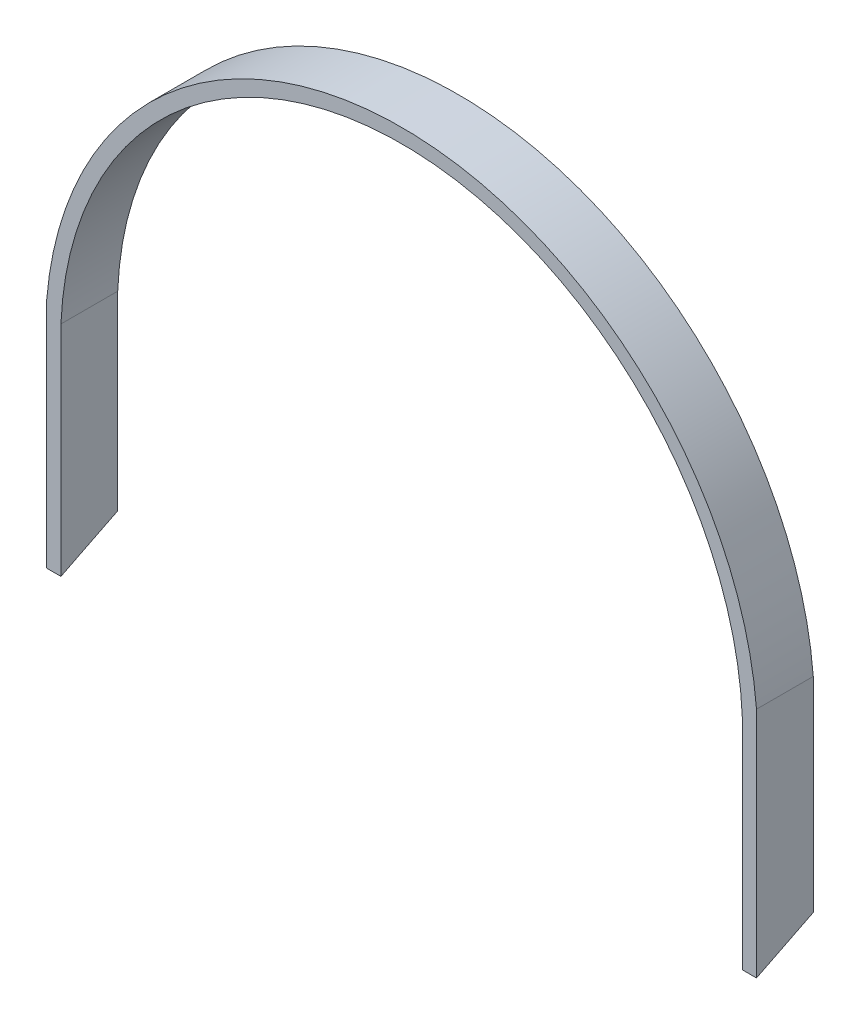
ISO-10303-21;
HEADER;
FILE_DESCRIPTION(('STEP AP214'),'2;1');
FILE_NAME('part.step','',(''),(''),'','','');
FILE_SCHEMA(('AUTOMOTIVE_DESIGN { 1 0 10303 214 1 1 1 1 }'));
ENDSEC;
DATA;
#1=APPLICATION_CONTEXT('core data for automotive mechanical design processes');
#2=APPLICATION_PROTOCOL_DEFINITION('international standard','automotive_design',2000,#1);
#3=PRODUCT_CONTEXT('',#1,'mechanical');
#4=PRODUCT('Part','Part','',(#3));
#5=PRODUCT_RELATED_PRODUCT_CATEGORY('part','',(#4));
#6=PRODUCT_DEFINITION_FORMATION('','',#4);
#7=PRODUCT_DEFINITION_CONTEXT('part definition',#1,'design');
#8=PRODUCT_DEFINITION('design','',#6,#7);
#9=PRODUCT_DEFINITION_SHAPE('','',#8);
#10=(LENGTH_UNIT() NAMED_UNIT(*) SI_UNIT(.MILLI.,.METRE.));
#11=(NAMED_UNIT(*) PLANE_ANGLE_UNIT() SI_UNIT($,.RADIAN.));
#12=(NAMED_UNIT(*) SI_UNIT($,.STERADIAN.) SOLID_ANGLE_UNIT());
#13=UNCERTAINTY_MEASURE_WITH_UNIT(LENGTH_MEASURE(1.E-05),#10,'distance_accuracy_value','');
#14=(GEOMETRIC_REPRESENTATION_CONTEXT(3) GLOBAL_UNCERTAINTY_ASSIGNED_CONTEXT((#13)) GLOBAL_UNIT_ASSIGNED_CONTEXT((#10,
#11,#12)) REPRESENTATION_CONTEXT('',''));
#15=CARTESIAN_POINT('',(0.,0.,0.));
#16=DIRECTION('',(0.,0.,1.));
#17=DIRECTION('',(1.,0.,0.));
#18=AXIS2_PLACEMENT_3D('',#15,#16,#17);
#19=CARTESIAN_POINT('',(0.,0.,20.));
#20=DIRECTION('',(1.,0.,0.));
#21=DIRECTION('',(0.,0.,-1.));
#22=AXIS2_PLACEMENT_3D('',#19,#20,#21);
#23=PLANE('',#22);
#24=DIRECTION('',(0.,-1.,0.));
#25=VECTOR('',#24,1.);
#26=CARTESIAN_POINT('',(0.,0.,0.));
#27=LINE('',#26,#25);
#28=CARTESIAN_POINT('',(0.,82.,0.));
#29=VERTEX_POINT('',#28);
#30=CARTESIAN_POINT('',(0.,9.99999999999999,0.));
#31=VERTEX_POINT('',#30);
#32=EDGE_CURVE('E114',#29,#31,#27,.T.);
#33=ORIENTED_EDGE('',*,*,#32,.T.);
#34=DIRECTION('',(0.,-0.447213595499958,0.894427190999916));
#35=VECTOR('',#34,1.);
#36=CARTESIAN_POINT('',(0.,10.,0.));
#37=LINE('',#36,#35);
#38=CARTESIAN_POINT('',(0.,0.,20.));
#39=VERTEX_POINT('',#38);
#40=EDGE_CURVE('E59',#31,#39,#37,.T.);
#41=ORIENTED_EDGE('',*,*,#40,.T.);
#42=DIRECTION('',(0.,-1.,0.));
#43=VECTOR('',#42,1.);
#44=CARTESIAN_POINT('',(0.,0.,20.));
#45=LINE('',#44,#43);
#46=CARTESIAN_POINT('',(0.,82.,20.));
#47=VERTEX_POINT('',#46);
#48=EDGE_CURVE('E107',#47,#39,#45,.T.);
#49=ORIENTED_EDGE('',*,*,#48,.F.);
#50=DIRECTION('',(0.,0.,-1.));
#51=VECTOR('',#50,1.);
#52=CARTESIAN_POINT('',(0.,82.,20.));
#53=LINE('',#52,#51);
#54=EDGE_CURVE('E149',#47,#29,#53,.T.);
#55=ORIENTED_EDGE('',*,*,#54,.T.);
#56=EDGE_LOOP('',(#33,#41,#49,#55));
#57=FACE_BOUND('',#56,.T.);
#58=ADVANCED_FACE('F38',(#57),#23,.F.);
#59=CARTESIAN_POINT('',(5.,0.,20.));
#60=DIRECTION('',(-1.,0.,0.));
#61=DIRECTION('',(0.,-1.,0.));
#62=AXIS2_PLACEMENT_3D('',#59,#60,#61);
#63=PLANE('',#62);
#64=DIRECTION('',(0.,1.,0.));
#65=VECTOR('',#64,1.);
#66=CARTESIAN_POINT('',(5.,0.,20.));
#67=LINE('',#66,#65);
#68=CARTESIAN_POINT('',(5.,0.,20.));
#69=VERTEX_POINT('',#68);
#70=CARTESIAN_POINT('',(5.,77.,20.));
#71=VERTEX_POINT('',#70);
#72=EDGE_CURVE('E106',#69,#71,#67,.T.);
#73=ORIENTED_EDGE('',*,*,#72,.F.);
#74=DIRECTION('',(0.,0.447213595499958,-0.894427190999916));
#75=VECTOR('',#74,1.);
#76=CARTESIAN_POINT('',(5.,0.,20.));
#77=LINE('',#76,#75);
#78=CARTESIAN_POINT('',(5.,10.,0.));
#79=VERTEX_POINT('',#78);
#80=EDGE_CURVE('E102',#69,#79,#77,.T.);
#81=ORIENTED_EDGE('',*,*,#80,.T.);
#82=DIRECTION('',(0.,1.,0.));
#83=VECTOR('',#82,1.);
#84=CARTESIAN_POINT('',(5.,0.,0.));
#85=LINE('',#84,#83);
#86=CARTESIAN_POINT('',(5.,77.,0.));
#87=VERTEX_POINT('',#86);
#88=EDGE_CURVE('E152',#79,#87,#85,.T.);
#89=ORIENTED_EDGE('',*,*,#88,.T.);
#90=DIRECTION('',(0.,0.,-1.));
#91=VECTOR('',#90,1.);
#92=CARTESIAN_POINT('',(5.,77.,20.));
#93=LINE('',#92,#91);
#94=EDGE_CURVE('E45',#71,#87,#93,.T.);
#95=ORIENTED_EDGE('',*,*,#94,.F.);
#96=EDGE_LOOP('',(#73,#81,#89,#95));
#97=FACE_BOUND('',#96,.T.);
#98=ADVANCED_FACE('F193',(#97),#63,.F.);
#99=CARTESIAN_POINT('',(125.,71.8913043478261,20.));
#100=DIRECTION('',(0.,0.,-1.));
#101=DIRECTION('',(-1.,0.,0.));
#102=AXIS2_PLACEMENT_3D('',#99,#100,#101);
#103=CYLINDRICAL_SURFACE('',#102,120.108695652174);
#104=CARTESIAN_POINT('',(125.,71.8913043478261,0.));
#105=DIRECTION('',(0.,0.,-1.));
#106=DIRECTION('',(1.,0.,0.));
#107=AXIS2_PLACEMENT_3D('',#104,#105,#106);
#108=CIRCLE('',#107,120.108695652174);
#109=CARTESIAN_POINT('',(245.,77.,0.));
#110=VERTEX_POINT('',#109);
#111=EDGE_CURVE('E155',#87,#110,#108,.T.);
#112=ORIENTED_EDGE('',*,*,#111,.T.);
#113=DIRECTION('',(0.,0.,-1.));
#114=VECTOR('',#113,1.);
#115=CARTESIAN_POINT('',(245.,77.,20.));
#116=LINE('',#115,#114);
#117=CARTESIAN_POINT('',(245.,77.,20.));
#118=VERTEX_POINT('',#117);
#119=EDGE_CURVE('E170',#118,#110,#116,.T.);
#120=ORIENTED_EDGE('',*,*,#119,.F.);
#121=CARTESIAN_POINT('',(125.,71.8913043478261,20.));
#122=DIRECTION('',(0.,0.,-1.));
#123=DIRECTION('',(1.,0.,0.));
#124=AXIS2_PLACEMENT_3D('',#121,#122,#123);
#125=CIRCLE('',#124,120.108695652174);
#126=EDGE_CURVE('E135',#71,#118,#125,.T.);
#127=ORIENTED_EDGE('',*,*,#126,.F.);
#128=ORIENTED_EDGE('',*,*,#94,.T.);
#129=EDGE_LOOP('',(#112,#120,#127,#128));
#130=FACE_BOUND('',#129,.T.);
#131=ADVANCED_FACE('F181',(#130),#103,.F.);
#132=CARTESIAN_POINT('',(245.,0.,20.));
#133=DIRECTION('',(1.,0.,0.));
#134=DIRECTION('',(0.,0.,-1.));
#135=AXIS2_PLACEMENT_3D('',#132,#133,#134);
#136=PLANE('',#135);
#137=DIRECTION('',(0.,-1.,0.));
#138=VECTOR('',#137,1.);
#139=CARTESIAN_POINT('',(245.,0.,0.));
#140=LINE('',#139,#138);
#141=CARTESIAN_POINT('',(245.,10.,0.));
#142=VERTEX_POINT('',#141);
#143=EDGE_CURVE('E158',#110,#142,#140,.T.);
#144=ORIENTED_EDGE('',*,*,#143,.T.);
#145=DIRECTION('',(0.,-0.447213595499958,0.894427190999916));
#146=VECTOR('',#145,1.);
#147=CARTESIAN_POINT('',(245.,0.,20.));
#148=LINE('',#147,#146);
#149=CARTESIAN_POINT('',(245.,0.,20.));
#150=VERTEX_POINT('',#149);
#151=EDGE_CURVE('E51',#142,#150,#148,.T.);
#152=ORIENTED_EDGE('',*,*,#151,.T.);
#153=DIRECTION('',(0.,-1.,0.));
#154=VECTOR('',#153,1.);
#155=CARTESIAN_POINT('',(245.,0.,20.));
#156=LINE('',#155,#154);
#157=EDGE_CURVE('E138',#118,#150,#156,.T.);
#158=ORIENTED_EDGE('',*,*,#157,.F.);
#159=ORIENTED_EDGE('',*,*,#119,.T.);
#160=EDGE_LOOP('',(#144,#152,#158,#159));
#161=FACE_BOUND('',#160,.T.);
#162=ADVANCED_FACE('F190',(#161),#136,.F.);
#163=CARTESIAN_POINT('',(250.,0.,20.));
#164=DIRECTION('',(-1.,0.,0.));
#165=DIRECTION('',(0.,0.,1.));
#166=AXIS2_PLACEMENT_3D('',#163,#164,#165);
#167=PLANE('',#166);
#168=DIRECTION('',(0.,1.,0.));
#169=VECTOR('',#168,1.);
#170=CARTESIAN_POINT('',(250.,0.,20.));
#171=LINE('',#170,#169);
#172=CARTESIAN_POINT('',(250.,0.,20.));
#173=VERTEX_POINT('',#172);
#174=CARTESIAN_POINT('',(250.,82.,20.));
#175=VERTEX_POINT('',#174);
#176=EDGE_CURVE('E145',#173,#175,#171,.T.);
#177=ORIENTED_EDGE('',*,*,#176,.F.);
#178=DIRECTION('',(0.,-0.447213595499958,0.894427190999916));
#179=VECTOR('',#178,1.);
#180=CARTESIAN_POINT('',(250.,10.,0.));
#181=LINE('',#180,#179);
#182=CARTESIAN_POINT('',(250.,10.,0.));
#183=VERTEX_POINT('',#182);
#184=EDGE_CURVE('E116',#183,#173,#181,.T.);
#185=ORIENTED_EDGE('',*,*,#184,.F.);
#186=DIRECTION('',(0.,1.,0.));
#187=VECTOR('',#186,1.);
#188=CARTESIAN_POINT('',(250.,0.,0.));
#189=LINE('',#188,#187);
#190=CARTESIAN_POINT('',(250.,82.,0.));
#191=VERTEX_POINT('',#190);
#192=EDGE_CURVE('E128',#183,#191,#189,.T.);
#193=ORIENTED_EDGE('',*,*,#192,.T.);
#194=DIRECTION('',(0.,0.,-1.));
#195=VECTOR('',#194,1.);
#196=CARTESIAN_POINT('',(250.,82.,20.));
#197=LINE('',#196,#195);
#198=EDGE_CURVE('E166',#175,#191,#197,.T.);
#199=ORIENTED_EDGE('',*,*,#198,.F.);
#200=EDGE_LOOP('',(#177,#185,#193,#199));
#201=FACE_BOUND('',#200,.T.);
#202=ADVANCED_FACE('F199',(#201),#167,.F.);
#203=CARTESIAN_POINT('',(125.,71.5652173913044,20.));
#204=DIRECTION('',(0.,0.,-1.));
#205=DIRECTION('',(-1.,0.,0.));
#206=AXIS2_PLACEMENT_3D('',#203,#204,#205);
#207=CYLINDRICAL_SURFACE('',#206,125.434782608696);
#208=CARTESIAN_POINT('',(125.,71.5652173913044,0.));
#209=DIRECTION('',(0.,0.,1.));
#210=DIRECTION('',(-1.,0.,0.));
#211=AXIS2_PLACEMENT_3D('',#208,#209,#210);
#212=CIRCLE('',#211,125.434782608696);
#213=EDGE_CURVE('E123',#191,#29,#212,.T.);
#214=ORIENTED_EDGE('',*,*,#213,.T.);
#215=ORIENTED_EDGE('',*,*,#54,.F.);
#216=CARTESIAN_POINT('',(125.,71.5652173913044,20.));
#217=DIRECTION('',(0.,0.,1.));
#218=DIRECTION('',(-1.,0.,0.));
#219=AXIS2_PLACEMENT_3D('',#216,#217,#218);
#220=CIRCLE('',#219,125.434782608696);
#221=EDGE_CURVE('E120',#175,#47,#220,.T.);
#222=ORIENTED_EDGE('',*,*,#221,.F.);
#223=ORIENTED_EDGE('',*,*,#198,.T.);
#224=EDGE_LOOP('',(#214,#215,#222,#223));
#225=FACE_BOUND('',#224,.T.);
#226=ADVANCED_FACE('F203',(#225),#207,.T.);
#227=CARTESIAN_POINT('',(125.,71.5652173913044,20.));
#228=DIRECTION('',(0.,0.,-1.));
#229=DIRECTION('',(-1.,0.,0.));
#230=AXIS2_PLACEMENT_3D('',#227,#228,#229);
#231=PLANE('',#230);
#232=ORIENTED_EDGE('',*,*,#48,.T.);
#233=DIRECTION('',(1.,0.,0.));
#234=VECTOR('',#233,1.);
#235=CARTESIAN_POINT('',(0.,0.,20.));
#236=LINE('',#235,#234);
#237=EDGE_CURVE('E99',#39,#69,#236,.T.);
#238=ORIENTED_EDGE('',*,*,#237,.T.);
#239=ORIENTED_EDGE('',*,*,#72,.T.);
#240=ORIENTED_EDGE('',*,*,#126,.T.);
#241=ORIENTED_EDGE('',*,*,#157,.T.);
#242=DIRECTION('',(1.,0.,0.));
#243=VECTOR('',#242,1.);
#244=CARTESIAN_POINT('',(250.,0.,20.));
#245=LINE('',#244,#243);
#246=EDGE_CURVE('E142',#150,#173,#245,.T.);
#247=ORIENTED_EDGE('',*,*,#246,.T.);
#248=ORIENTED_EDGE('',*,*,#176,.T.);
#249=ORIENTED_EDGE('',*,*,#221,.T.);
#250=EDGE_LOOP('',(#232,#238,#239,#240,#241,#247,#248,#249));
#251=FACE_BOUND('',#250,.T.);
#252=ADVANCED_FACE('F118',(#251),#231,.F.);
#253=CARTESIAN_POINT('',(125.,71.5652173913044,0.));
#254=DIRECTION('',(0.,0.,-1.));
#255=DIRECTION('',(-1.,0.,0.));
#256=AXIS2_PLACEMENT_3D('',#253,#254,#255);
#257=PLANE('',#256);
#258=DIRECTION('',(1.,0.,0.));
#259=VECTOR('',#258,1.);
#260=CARTESIAN_POINT('',(0.,10.,0.));
#261=LINE('',#260,#259);
#262=EDGE_CURVE('E115',#31,#79,#261,.T.);
#263=ORIENTED_EDGE('',*,*,#262,.F.);
#264=ORIENTED_EDGE('',*,*,#32,.F.);
#265=ORIENTED_EDGE('',*,*,#213,.F.);
#266=ORIENTED_EDGE('',*,*,#192,.F.);
#267=DIRECTION('',(1.,0.,0.));
#268=VECTOR('',#267,1.);
#269=CARTESIAN_POINT('',(125.,10.,0.));
#270=LINE('',#269,#268);
#271=EDGE_CURVE('E11',#142,#183,#270,.T.);
#272=ORIENTED_EDGE('',*,*,#271,.F.);
#273=ORIENTED_EDGE('',*,*,#143,.F.);
#274=ORIENTED_EDGE('',*,*,#111,.F.);
#275=ORIENTED_EDGE('',*,*,#88,.F.);
#276=EDGE_LOOP('',(#263,#264,#265,#266,#272,#273,#274,#275));
#277=FACE_BOUND('',#276,.T.);
#278=ADVANCED_FACE('F187',(#277),#257,.T.);
#279=CARTESIAN_POINT('',(0.,10.,0.));
#280=DIRECTION('',(0.,0.894427190999916,0.447213595499958));
#281=DIRECTION('',(0.,-0.447213595499958,0.894427190999916));
#282=AXIS2_PLACEMENT_3D('',#279,#280,#281);
#283=PLANE('',#282);
#284=ORIENTED_EDGE('',*,*,#271,.T.);
#285=ORIENTED_EDGE('',*,*,#184,.T.);
#286=ORIENTED_EDGE('',*,*,#246,.F.);
#287=ORIENTED_EDGE('',*,*,#151,.F.);
#288=EDGE_LOOP('',(#284,#285,#286,#287));
#289=FACE_BOUND('',#288,.T.);
#290=ADVANCED_FACE('F197',(#289),#283,.F.);
#291=ORIENTED_EDGE('',*,*,#237,.F.);
#292=ORIENTED_EDGE('',*,*,#40,.F.);
#293=ORIENTED_EDGE('',*,*,#262,.T.);
#294=ORIENTED_EDGE('',*,*,#80,.F.);
#295=EDGE_LOOP('',(#291,#292,#293,#294));
#296=FACE_BOUND('',#295,.T.);
#297=ADVANCED_FACE('F100',(#296),#283,.F.);
#298=CLOSED_SHELL('',(#58,#98,#131,#162,#202,#226,#252,#278,#290,#297));
#299=MANIFOLD_SOLID_BREP('B2',#298);
#300=ADVANCED_BREP_SHAPE_REPRESENTATION('',(#18,#299),#14);
#301=SHAPE_DEFINITION_REPRESENTATION(#9,#300);
ENDSEC;
END-ISO-10303-21;
